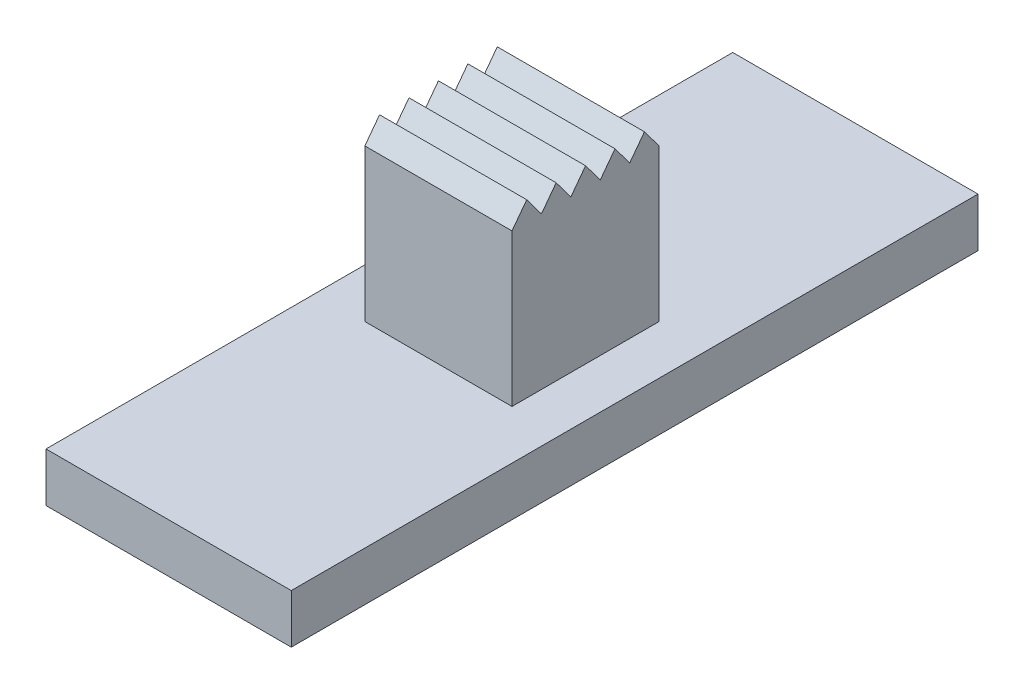
ISO-10303-21;
HEADER;
FILE_DESCRIPTION(('STEP AP214'),'2;1');
FILE_NAME('part.step','',(''),(''),'','','');
FILE_SCHEMA(('AUTOMOTIVE_DESIGN { 1 0 10303 214 1 1 1 1 }'));
ENDSEC;
DATA;
#1=APPLICATION_CONTEXT('core data for automotive mechanical design processes');
#2=APPLICATION_PROTOCOL_DEFINITION('international standard','automotive_design',2000,#1);
#3=PRODUCT_CONTEXT('',#1,'mechanical');
#4=PRODUCT('Part','Part','',(#3));
#5=PRODUCT_RELATED_PRODUCT_CATEGORY('part','',(#4));
#6=PRODUCT_DEFINITION_FORMATION('','',#4);
#7=PRODUCT_DEFINITION_CONTEXT('part definition',#1,'design');
#8=PRODUCT_DEFINITION('design','',#6,#7);
#9=PRODUCT_DEFINITION_SHAPE('','',#8);
#10=(LENGTH_UNIT() NAMED_UNIT(*) SI_UNIT(.MILLI.,.METRE.));
#11=(NAMED_UNIT(*) PLANE_ANGLE_UNIT() SI_UNIT($,.RADIAN.));
#12=(NAMED_UNIT(*) SI_UNIT($,.STERADIAN.) SOLID_ANGLE_UNIT());
#13=UNCERTAINTY_MEASURE_WITH_UNIT(LENGTH_MEASURE(1.E-05),#10,'distance_accuracy_value','');
#14=(GEOMETRIC_REPRESENTATION_CONTEXT(3) GLOBAL_UNCERTAINTY_ASSIGNED_CONTEXT((#13)) GLOBAL_UNIT_ASSIGNED_CONTEXT((#10,
#11,#12)) REPRESENTATION_CONTEXT('',''));
#15=CARTESIAN_POINT('',(0.,0.,0.));
#16=DIRECTION('',(0.,0.,1.));
#17=DIRECTION('',(1.,0.,0.));
#18=AXIS2_PLACEMENT_3D('',#15,#16,#17);
#19=CARTESIAN_POINT('',(-1.5,0.,0.));
#20=DIRECTION('',(-1.,0.,0.));
#21=DIRECTION('',(0.,0.,1.));
#22=AXIS2_PLACEMENT_3D('',#19,#20,#21);
#23=PLANE('',#22);
#24=DIRECTION('',(0.,1.,0.));
#25=VECTOR('',#24,1.);
#26=CARTESIAN_POINT('',(-1.5,3.1,-1.5));
#27=LINE('',#26,#25);
#28=CARTESIAN_POINT('',(-1.5,0.,-1.5));
#29=VERTEX_POINT('',#28);
#30=CARTESIAN_POINT('',(-1.5,3.1,-1.5));
#31=VERTEX_POINT('',#30);
#32=EDGE_CURVE('E230',#29,#31,#27,.T.);
#33=ORIENTED_EDGE('',*,*,#32,.F.);
#34=DIRECTION('',(0.,0.,1.));
#35=VECTOR('',#34,1.);
#36=CARTESIAN_POINT('',(-1.5,0.,7.));
#37=LINE('',#36,#35);
#38=CARTESIAN_POINT('',(-1.5,0.,1.5));
#39=VERTEX_POINT('',#38);
#40=EDGE_CURVE('E11',#29,#39,#37,.T.);
#41=ORIENTED_EDGE('',*,*,#40,.T.);
#42=DIRECTION('',(0.,-1.,0.));
#43=VECTOR('',#42,1.);
#44=CARTESIAN_POINT('',(-1.5,0.,1.5));
#45=LINE('',#44,#43);
#46=CARTESIAN_POINT('',(-1.5,3.1,1.5));
#47=VERTEX_POINT('',#46);
#48=EDGE_CURVE('E262',#47,#39,#45,.T.);
#49=ORIENTED_EDGE('',*,*,#48,.F.);
#50=DIRECTION('',(0.,-0.8,0.6));
#51=VECTOR('',#50,1.);
#52=CARTESIAN_POINT('',(-1.5,3.1,1.5));
#53=LINE('',#52,#51);
#54=CARTESIAN_POINT('',(-1.5,3.5,1.2));
#55=VERTEX_POINT('',#54);
#56=EDGE_CURVE('E260',#55,#47,#53,.T.);
#57=ORIENTED_EDGE('',*,*,#56,.F.);
#58=DIRECTION('',(0.,0.8,0.6));
#59=VECTOR('',#58,1.);
#60=CARTESIAN_POINT('',(-1.5,3.5,1.2));
#61=LINE('',#60,#59);
#62=CARTESIAN_POINT('',(-1.5,3.1,0.9));
#63=VERTEX_POINT('',#62);
#64=EDGE_CURVE('E257',#63,#55,#61,.T.);
#65=ORIENTED_EDGE('',*,*,#64,.F.);
#66=DIRECTION('',(0.,-0.8,0.6));
#67=VECTOR('',#66,1.);
#68=CARTESIAN_POINT('',(-1.5,3.1,0.9));
#69=LINE('',#68,#67);
#70=CARTESIAN_POINT('',(-1.5,3.5,0.6));
#71=VERTEX_POINT('',#70);
#72=EDGE_CURVE('E254',#71,#63,#69,.T.);
#73=ORIENTED_EDGE('',*,*,#72,.F.);
#74=DIRECTION('',(0.,0.8,0.6));
#75=VECTOR('',#74,1.);
#76=CARTESIAN_POINT('',(-1.5,3.5,0.6));
#77=LINE('',#76,#75);
#78=CARTESIAN_POINT('',(-1.5,3.1,0.3));
#79=VERTEX_POINT('',#78);
#80=EDGE_CURVE('E251',#79,#71,#77,.T.);
#81=ORIENTED_EDGE('',*,*,#80,.F.);
#82=DIRECTION('',(0.,-0.8,0.6));
#83=VECTOR('',#82,1.);
#84=CARTESIAN_POINT('',(-1.5,3.1,0.3));
#85=LINE('',#84,#83);
#86=CARTESIAN_POINT('',(-1.5,3.5,0.));
#87=VERTEX_POINT('',#86);
#88=EDGE_CURVE('E248',#87,#79,#85,.T.);
#89=ORIENTED_EDGE('',*,*,#88,.F.);
#90=DIRECTION('',(0.,0.8,0.6));
#91=VECTOR('',#90,1.);
#92=CARTESIAN_POINT('',(-1.5,3.1,-0.3));
#93=LINE('',#92,#91);
#94=CARTESIAN_POINT('',(-1.5,3.1,-0.3));
#95=VERTEX_POINT('',#94);
#96=EDGE_CURVE('E245',#95,#87,#93,.T.);
#97=ORIENTED_EDGE('',*,*,#96,.F.);
#98=DIRECTION('',(0.,-0.8,0.6));
#99=VECTOR('',#98,1.);
#100=CARTESIAN_POINT('',(-1.5,3.5,-0.600000000000001));
#101=LINE('',#100,#99);
#102=CARTESIAN_POINT('',(-1.5,3.5,-0.600000000000001));
#103=VERTEX_POINT('',#102);
#104=EDGE_CURVE('E242',#103,#95,#101,.T.);
#105=ORIENTED_EDGE('',*,*,#104,.F.);
#106=DIRECTION('',(0.,0.8,0.6));
#107=VECTOR('',#106,1.);
#108=CARTESIAN_POINT('',(-1.5,3.1,-0.900000000000001));
#109=LINE('',#108,#107);
#110=CARTESIAN_POINT('',(-1.5,3.1,-0.900000000000001));
#111=VERTEX_POINT('',#110);
#112=EDGE_CURVE('E239',#111,#103,#109,.T.);
#113=ORIENTED_EDGE('',*,*,#112,.F.);
#114=DIRECTION('',(0.,-0.8,0.6));
#115=VECTOR('',#114,1.);
#116=CARTESIAN_POINT('',(-1.5,3.5,-1.2));
#117=LINE('',#116,#115);
#118=CARTESIAN_POINT('',(-1.5,3.5,-1.2));
#119=VERTEX_POINT('',#118);
#120=EDGE_CURVE('E236',#119,#111,#117,.T.);
#121=ORIENTED_EDGE('',*,*,#120,.F.);
#122=DIRECTION('',(0.,0.8,0.6));
#123=VECTOR('',#122,1.);
#124=CARTESIAN_POINT('',(-1.5,3.1,-1.5));
#125=LINE('',#124,#123);
#126=EDGE_CURVE('E233',#31,#119,#125,.T.);
#127=ORIENTED_EDGE('',*,*,#126,.F.);
#128=EDGE_LOOP('',(#33,#41,#49,#57,#65,#73,#81,#89,#97,#105,#113,#121,#127));
#129=FACE_BOUND('',#128,.T.);
#130=ADVANCED_FACE('F33',(#129),#23,.T.);
#131=CARTESIAN_POINT('',(1.5,0.,0.));
#132=DIRECTION('',(-1.,0.,0.));
#133=DIRECTION('',(0.,0.,1.));
#134=AXIS2_PLACEMENT_3D('',#131,#132,#133);
#135=PLANE('',#134);
#136=DIRECTION('',(0.,0.,1.));
#137=VECTOR('',#136,1.);
#138=CARTESIAN_POINT('',(1.5,0.,7.));
#139=LINE('',#138,#137);
#140=CARTESIAN_POINT('',(1.5,0.,-1.5));
#141=VERTEX_POINT('',#140);
#142=CARTESIAN_POINT('',(1.5,0.,1.5));
#143=VERTEX_POINT('',#142);
#144=EDGE_CURVE('E42',#141,#143,#139,.T.);
#145=ORIENTED_EDGE('',*,*,#144,.F.);
#146=DIRECTION('',(0.,1.,0.));
#147=VECTOR('',#146,1.);
#148=CARTESIAN_POINT('',(1.5,3.1,-1.5));
#149=LINE('',#148,#147);
#150=CARTESIAN_POINT('',(1.5,3.1,-1.5));
#151=VERTEX_POINT('',#150);
#152=EDGE_CURVE('E192',#141,#151,#149,.T.);
#153=ORIENTED_EDGE('',*,*,#152,.T.);
#154=DIRECTION('',(0.,0.8,0.6));
#155=VECTOR('',#154,1.);
#156=CARTESIAN_POINT('',(1.5,3.1,-1.5));
#157=LINE('',#156,#155);
#158=CARTESIAN_POINT('',(1.5,3.5,-1.2));
#159=VERTEX_POINT('',#158);
#160=EDGE_CURVE('E197',#151,#159,#157,.T.);
#161=ORIENTED_EDGE('',*,*,#160,.T.);
#162=DIRECTION('',(0.,-0.8,0.6));
#163=VECTOR('',#162,1.);
#164=CARTESIAN_POINT('',(1.5,3.5,-1.2));
#165=LINE('',#164,#163);
#166=CARTESIAN_POINT('',(1.5,3.1,-0.900000000000001));
#167=VERTEX_POINT('',#166);
#168=EDGE_CURVE('E200',#159,#167,#165,.T.);
#169=ORIENTED_EDGE('',*,*,#168,.T.);
#170=DIRECTION('',(0.,0.8,0.6));
#171=VECTOR('',#170,1.);
#172=CARTESIAN_POINT('',(1.5,3.1,-0.900000000000001));
#173=LINE('',#172,#171);
#174=CARTESIAN_POINT('',(1.5,3.5,-0.600000000000001));
#175=VERTEX_POINT('',#174);
#176=EDGE_CURVE('E203',#167,#175,#173,.T.);
#177=ORIENTED_EDGE('',*,*,#176,.T.);
#178=DIRECTION('',(0.,-0.8,0.6));
#179=VECTOR('',#178,1.);
#180=CARTESIAN_POINT('',(1.5,3.5,-0.600000000000001));
#181=LINE('',#180,#179);
#182=CARTESIAN_POINT('',(1.5,3.1,-0.3));
#183=VERTEX_POINT('',#182);
#184=EDGE_CURVE('E206',#175,#183,#181,.T.);
#185=ORIENTED_EDGE('',*,*,#184,.T.);
#186=DIRECTION('',(0.,0.8,0.6));
#187=VECTOR('',#186,1.);
#188=CARTESIAN_POINT('',(1.5,3.1,-0.3));
#189=LINE('',#188,#187);
#190=CARTESIAN_POINT('',(1.5,3.5,0.));
#191=VERTEX_POINT('',#190);
#192=EDGE_CURVE('E209',#183,#191,#189,.T.);
#193=ORIENTED_EDGE('',*,*,#192,.T.);
#194=DIRECTION('',(0.,-0.8,0.6));
#195=VECTOR('',#194,1.);
#196=CARTESIAN_POINT('',(1.5,3.1,0.3));
#197=LINE('',#196,#195);
#198=CARTESIAN_POINT('',(1.5,3.1,0.3));
#199=VERTEX_POINT('',#198);
#200=EDGE_CURVE('E212',#191,#199,#197,.T.);
#201=ORIENTED_EDGE('',*,*,#200,.T.);
#202=DIRECTION('',(0.,0.8,0.6));
#203=VECTOR('',#202,1.);
#204=CARTESIAN_POINT('',(1.5,3.5,0.6));
#205=LINE('',#204,#203);
#206=CARTESIAN_POINT('',(1.5,3.5,0.6));
#207=VERTEX_POINT('',#206);
#208=EDGE_CURVE('E215',#199,#207,#205,.T.);
#209=ORIENTED_EDGE('',*,*,#208,.T.);
#210=DIRECTION('',(0.,-0.8,0.6));
#211=VECTOR('',#210,1.);
#212=CARTESIAN_POINT('',(1.5,3.1,0.9));
#213=LINE('',#212,#211);
#214=CARTESIAN_POINT('',(1.5,3.1,0.9));
#215=VERTEX_POINT('',#214);
#216=EDGE_CURVE('E218',#207,#215,#213,.T.);
#217=ORIENTED_EDGE('',*,*,#216,.T.);
#218=DIRECTION('',(0.,0.8,0.6));
#219=VECTOR('',#218,1.);
#220=CARTESIAN_POINT('',(1.5,3.5,1.2));
#221=LINE('',#220,#219);
#222=CARTESIAN_POINT('',(1.5,3.5,1.2));
#223=VERTEX_POINT('',#222);
#224=EDGE_CURVE('E221',#215,#223,#221,.T.);
#225=ORIENTED_EDGE('',*,*,#224,.T.);
#226=DIRECTION('',(0.,-0.8,0.6));
#227=VECTOR('',#226,1.);
#228=CARTESIAN_POINT('',(1.5,3.1,1.5));
#229=LINE('',#228,#227);
#230=CARTESIAN_POINT('',(1.5,3.1,1.5));
#231=VERTEX_POINT('',#230);
#232=EDGE_CURVE('E224',#223,#231,#229,.T.);
#233=ORIENTED_EDGE('',*,*,#232,.T.);
#234=DIRECTION('',(0.,-1.,0.));
#235=VECTOR('',#234,1.);
#236=CARTESIAN_POINT('',(1.5,0.,1.5));
#237=LINE('',#236,#235);
#238=EDGE_CURVE('E227',#231,#143,#237,.T.);
#239=ORIENTED_EDGE('',*,*,#238,.T.);
#240=EDGE_LOOP('',(#145,#153,#161,#169,#177,#185,#193,#201,#209,#217,#225,#233,#239));
#241=FACE_BOUND('',#240,.T.);
#242=ADVANCED_FACE('F308',(#241),#135,.F.);
#243=CARTESIAN_POINT('',(-1.5,-1.,7.));
#244=DIRECTION('',(0.,0.,1.));
#245=DIRECTION('',(1.,0.,0.));
#246=AXIS2_PLACEMENT_3D('',#243,#244,#245);
#247=PLANE('',#246);
#248=DIRECTION('',(1.,0.,0.));
#249=VECTOR('',#248,1.);
#250=CARTESIAN_POINT('',(-1.5,-1.,7.));
#251=LINE('',#250,#249);
#252=CARTESIAN_POINT('',(-2.5,-1.,7.));
#253=VERTEX_POINT('',#252);
#254=CARTESIAN_POINT('',(2.5,-1.,7.));
#255=VERTEX_POINT('',#254);
#256=EDGE_CURVE('E37',#253,#255,#251,.T.);
#257=ORIENTED_EDGE('',*,*,#256,.T.);
#258=DIRECTION('',(0.,-1.,0.));
#259=VECTOR('',#258,1.);
#260=CARTESIAN_POINT('',(2.5,0.,7.));
#261=LINE('',#260,#259);
#262=CARTESIAN_POINT('',(2.5,0.,7.));
#263=VERTEX_POINT('',#262);
#264=EDGE_CURVE('E160',#263,#255,#261,.T.);
#265=ORIENTED_EDGE('',*,*,#264,.F.);
#266=DIRECTION('',(1.,0.,0.));
#267=VECTOR('',#266,1.);
#268=CARTESIAN_POINT('',(-1.5,0.,7.));
#269=LINE('',#268,#267);
#270=CARTESIAN_POINT('',(-2.5,0.,7.));
#271=VERTEX_POINT('',#270);
#272=EDGE_CURVE('E155',#271,#263,#269,.T.);
#273=ORIENTED_EDGE('',*,*,#272,.F.);
#274=DIRECTION('',(0.,-1.,0.));
#275=VECTOR('',#274,1.);
#276=CARTESIAN_POINT('',(-2.5,0.,7.));
#277=LINE('',#276,#275);
#278=EDGE_CURVE('E157',#271,#253,#277,.T.);
#279=ORIENTED_EDGE('',*,*,#278,.T.);
#280=EDGE_LOOP('',(#257,#265,#273,#279));
#281=FACE_BOUND('',#280,.T.);
#282=ADVANCED_FACE('F35',(#281),#247,.T.);
#283=CARTESIAN_POINT('',(-1.5,0.,7.));
#284=DIRECTION('',(0.,1.,0.));
#285=DIRECTION('',(0.,0.,1.));
#286=AXIS2_PLACEMENT_3D('',#283,#284,#285);
#287=PLANE('',#286);
#288=ORIENTED_EDGE('',*,*,#40,.F.);
#289=DIRECTION('',(1.,0.,0.));
#290=VECTOR('',#289,1.);
#291=CARTESIAN_POINT('',(-1.5,0.,-1.5));
#292=LINE('',#291,#290);
#293=EDGE_CURVE('E285',#29,#141,#292,.T.);
#294=ORIENTED_EDGE('',*,*,#293,.T.);
#295=ORIENTED_EDGE('',*,*,#144,.T.);
#296=DIRECTION('',(1.,0.,0.));
#297=VECTOR('',#296,1.);
#298=CARTESIAN_POINT('',(-1.5,0.,1.5));
#299=LINE('',#298,#297);
#300=EDGE_CURVE('E165',#39,#143,#299,.T.);
#301=ORIENTED_EDGE('',*,*,#300,.F.);
#302=EDGE_LOOP('',(#288,#294,#295,#301));
#303=FACE_BOUND('',#302,.T.);
#304=ORIENTED_EDGE('',*,*,#272,.T.);
#305=DIRECTION('',(0.,0.,1.));
#306=VECTOR('',#305,1.);
#307=CARTESIAN_POINT('',(2.5,0.,7.));
#308=LINE('',#307,#306);
#309=CARTESIAN_POINT('',(2.5,0.,-7.));
#310=VERTEX_POINT('',#309);
#311=EDGE_CURVE('E190',#310,#263,#308,.T.);
#312=ORIENTED_EDGE('',*,*,#311,.F.);
#313=DIRECTION('',(1.,0.,0.));
#314=VECTOR('',#313,1.);
#315=CARTESIAN_POINT('',(-1.5,0.,-7.));
#316=LINE('',#315,#314);
#317=CARTESIAN_POINT('',(-2.5,0.,-7.));
#318=VERTEX_POINT('',#317);
#319=EDGE_CURVE('E177',#318,#310,#316,.T.);
#320=ORIENTED_EDGE('',*,*,#319,.F.);
#321=DIRECTION('',(0.,0.,1.));
#322=VECTOR('',#321,1.);
#323=CARTESIAN_POINT('',(-2.5,0.,7.));
#324=LINE('',#323,#322);
#325=EDGE_CURVE('E171',#318,#271,#324,.T.);
#326=ORIENTED_EDGE('',*,*,#325,.T.);
#327=EDGE_LOOP('',(#304,#312,#320,#326));
#328=FACE_BOUND('',#327,.T.);
#329=ADVANCED_FACE('F176',(#303,#328),#287,.T.);
#330=CARTESIAN_POINT('',(-1.5,0.,1.5));
#331=DIRECTION('',(0.,0.,1.));
#332=DIRECTION('',(0.,-1.,0.));
#333=AXIS2_PLACEMENT_3D('',#330,#331,#332);
#334=PLANE('',#333);
#335=ORIENTED_EDGE('',*,*,#300,.T.);
#336=ORIENTED_EDGE('',*,*,#238,.F.);
#337=DIRECTION('',(1.,0.,0.));
#338=VECTOR('',#337,1.);
#339=CARTESIAN_POINT('',(-1.5,3.1,1.5));
#340=LINE('',#339,#338);
#341=EDGE_CURVE('E50',#47,#231,#340,.T.);
#342=ORIENTED_EDGE('',*,*,#341,.F.);
#343=ORIENTED_EDGE('',*,*,#48,.T.);
#344=EDGE_LOOP('',(#335,#336,#342,#343));
#345=FACE_BOUND('',#344,.T.);
#346=ADVANCED_FACE('F321',(#345),#334,.T.);
#347=CARTESIAN_POINT('',(-1.5,3.1,1.5));
#348=DIRECTION('',(0.,0.6,0.8));
#349=DIRECTION('',(0.,-0.8,0.6));
#350=AXIS2_PLACEMENT_3D('',#347,#348,#349);
#351=PLANE('',#350);
#352=ORIENTED_EDGE('',*,*,#341,.T.);
#353=ORIENTED_EDGE('',*,*,#232,.F.);
#354=DIRECTION('',(1.,0.,0.));
#355=VECTOR('',#354,1.);
#356=CARTESIAN_POINT('',(-1.5,3.5,1.2));
#357=LINE('',#356,#355);
#358=EDGE_CURVE('E58',#55,#223,#357,.T.);
#359=ORIENTED_EDGE('',*,*,#358,.F.);
#360=ORIENTED_EDGE('',*,*,#56,.T.);
#361=EDGE_LOOP('',(#352,#353,#359,#360));
#362=FACE_BOUND('',#361,.T.);
#363=ADVANCED_FACE('F325',(#362),#351,.T.);
#364=CARTESIAN_POINT('',(-1.5,3.5,1.2));
#365=DIRECTION('',(0.,0.6,-0.8));
#366=DIRECTION('',(0.,0.8,0.6));
#367=AXIS2_PLACEMENT_3D('',#364,#365,#366);
#368=PLANE('',#367);
#369=ORIENTED_EDGE('',*,*,#358,.T.);
#370=ORIENTED_EDGE('',*,*,#224,.F.);
#371=DIRECTION('',(1.,0.,0.));
#372=VECTOR('',#371,1.);
#373=CARTESIAN_POINT('',(-1.5,3.1,0.9));
#374=LINE('',#373,#372);
#375=EDGE_CURVE('E267',#63,#215,#374,.T.);
#376=ORIENTED_EDGE('',*,*,#375,.F.);
#377=ORIENTED_EDGE('',*,*,#64,.T.);
#378=EDGE_LOOP('',(#369,#370,#376,#377));
#379=FACE_BOUND('',#378,.T.);
#380=ADVANCED_FACE('F328',(#379),#368,.T.);
#381=CARTESIAN_POINT('',(-1.5,3.1,0.9));
#382=DIRECTION('',(0.,0.6,0.8));
#383=DIRECTION('',(0.,-0.8,0.6));
#384=AXIS2_PLACEMENT_3D('',#381,#382,#383);
#385=PLANE('',#384);
#386=ORIENTED_EDGE('',*,*,#375,.T.);
#387=ORIENTED_EDGE('',*,*,#216,.F.);
#388=DIRECTION('',(1.,0.,0.));
#389=VECTOR('',#388,1.);
#390=CARTESIAN_POINT('',(-1.5,3.5,0.6));
#391=LINE('',#390,#389);
#392=EDGE_CURVE('E269',#71,#207,#391,.T.);
#393=ORIENTED_EDGE('',*,*,#392,.F.);
#394=ORIENTED_EDGE('',*,*,#72,.T.);
#395=EDGE_LOOP('',(#386,#387,#393,#394));
#396=FACE_BOUND('',#395,.T.);
#397=ADVANCED_FACE('F331',(#396),#385,.T.);
#398=CARTESIAN_POINT('',(-1.5,3.5,0.6));
#399=DIRECTION('',(0.,0.6,-0.8));
#400=DIRECTION('',(0.,0.8,0.6));
#401=AXIS2_PLACEMENT_3D('',#398,#399,#400);
#402=PLANE('',#401);
#403=ORIENTED_EDGE('',*,*,#392,.T.);
#404=ORIENTED_EDGE('',*,*,#208,.F.);
#405=DIRECTION('',(1.,0.,0.));
#406=VECTOR('',#405,1.);
#407=CARTESIAN_POINT('',(-1.5,3.1,0.3));
#408=LINE('',#407,#406);
#409=EDGE_CURVE('E271',#79,#199,#408,.T.);
#410=ORIENTED_EDGE('',*,*,#409,.F.);
#411=ORIENTED_EDGE('',*,*,#80,.T.);
#412=EDGE_LOOP('',(#403,#404,#410,#411));
#413=FACE_BOUND('',#412,.T.);
#414=ADVANCED_FACE('F335',(#413),#402,.T.);
#415=CARTESIAN_POINT('',(-1.5,3.1,0.3));
#416=DIRECTION('',(0.,0.6,0.8));
#417=DIRECTION('',(0.,-0.8,0.6));
#418=AXIS2_PLACEMENT_3D('',#415,#416,#417);
#419=PLANE('',#418);
#420=ORIENTED_EDGE('',*,*,#409,.T.);
#421=ORIENTED_EDGE('',*,*,#200,.F.);
#422=DIRECTION('',(1.,0.,0.));
#423=VECTOR('',#422,1.);
#424=CARTESIAN_POINT('',(-1.5,3.5,0.));
#425=LINE('',#424,#423);
#426=EDGE_CURVE('E273',#87,#191,#425,.T.);
#427=ORIENTED_EDGE('',*,*,#426,.F.);
#428=ORIENTED_EDGE('',*,*,#88,.T.);
#429=EDGE_LOOP('',(#420,#421,#427,#428));
#430=FACE_BOUND('',#429,.T.);
#431=ADVANCED_FACE('F339',(#430),#419,.T.);
#432=CARTESIAN_POINT('',(-1.5,3.1,-0.3));
#433=DIRECTION('',(0.,0.6,-0.8));
#434=DIRECTION('',(0.,0.8,0.6));
#435=AXIS2_PLACEMENT_3D('',#432,#433,#434);
#436=PLANE('',#435);
#437=ORIENTED_EDGE('',*,*,#426,.T.);
#438=ORIENTED_EDGE('',*,*,#192,.F.);
#439=DIRECTION('',(1.,0.,0.));
#440=VECTOR('',#439,1.);
#441=CARTESIAN_POINT('',(-1.5,3.1,-0.3));
#442=LINE('',#441,#440);
#443=EDGE_CURVE('E275',#95,#183,#442,.T.);
#444=ORIENTED_EDGE('',*,*,#443,.F.);
#445=ORIENTED_EDGE('',*,*,#96,.T.);
#446=EDGE_LOOP('',(#437,#438,#444,#445));
#447=FACE_BOUND('',#446,.T.);
#448=ADVANCED_FACE('F343',(#447),#436,.T.);
#449=CARTESIAN_POINT('',(-1.5,3.5,-0.600000000000001));
#450=DIRECTION('',(0.,0.6,0.8));
#451=DIRECTION('',(0.,-0.8,0.6));
#452=AXIS2_PLACEMENT_3D('',#449,#450,#451);
#453=PLANE('',#452);
#454=ORIENTED_EDGE('',*,*,#443,.T.);
#455=ORIENTED_EDGE('',*,*,#184,.F.);
#456=DIRECTION('',(1.,0.,0.));
#457=VECTOR('',#456,1.);
#458=CARTESIAN_POINT('',(-1.5,3.5,-0.600000000000001));
#459=LINE('',#458,#457);
#460=EDGE_CURVE('E277',#103,#175,#459,.T.);
#461=ORIENTED_EDGE('',*,*,#460,.F.);
#462=ORIENTED_EDGE('',*,*,#104,.T.);
#463=EDGE_LOOP('',(#454,#455,#461,#462));
#464=FACE_BOUND('',#463,.T.);
#465=ADVANCED_FACE('F347',(#464),#453,.T.);
#466=CARTESIAN_POINT('',(-1.5,3.1,-0.900000000000001));
#467=DIRECTION('',(0.,0.6,-0.8));
#468=DIRECTION('',(0.,0.8,0.6));
#469=AXIS2_PLACEMENT_3D('',#466,#467,#468);
#470=PLANE('',#469);
#471=ORIENTED_EDGE('',*,*,#460,.T.);
#472=ORIENTED_EDGE('',*,*,#176,.F.);
#473=DIRECTION('',(1.,0.,0.));
#474=VECTOR('',#473,1.);
#475=CARTESIAN_POINT('',(-1.5,3.1,-0.900000000000001));
#476=LINE('',#475,#474);
#477=EDGE_CURVE('E279',#111,#167,#476,.T.);
#478=ORIENTED_EDGE('',*,*,#477,.F.);
#479=ORIENTED_EDGE('',*,*,#112,.T.);
#480=EDGE_LOOP('',(#471,#472,#478,#479));
#481=FACE_BOUND('',#480,.T.);
#482=ADVANCED_FACE('F351',(#481),#470,.T.);
#483=CARTESIAN_POINT('',(-1.5,3.5,-1.2));
#484=DIRECTION('',(0.,0.6,0.8));
#485=DIRECTION('',(0.,-0.8,0.6));
#486=AXIS2_PLACEMENT_3D('',#483,#484,#485);
#487=PLANE('',#486);
#488=ORIENTED_EDGE('',*,*,#477,.T.);
#489=ORIENTED_EDGE('',*,*,#168,.F.);
#490=DIRECTION('',(1.,0.,0.));
#491=VECTOR('',#490,1.);
#492=CARTESIAN_POINT('',(-1.5,3.5,-1.2));
#493=LINE('',#492,#491);
#494=EDGE_CURVE('E281',#119,#159,#493,.T.);
#495=ORIENTED_EDGE('',*,*,#494,.F.);
#496=ORIENTED_EDGE('',*,*,#120,.T.);
#497=EDGE_LOOP('',(#488,#489,#495,#496));
#498=FACE_BOUND('',#497,.T.);
#499=ADVANCED_FACE('F355',(#498),#487,.T.);
#500=CARTESIAN_POINT('',(-1.5,3.1,-1.5));
#501=DIRECTION('',(0.,0.6,-0.8));
#502=DIRECTION('',(0.,0.8,0.6));
#503=AXIS2_PLACEMENT_3D('',#500,#501,#502);
#504=PLANE('',#503);
#505=ORIENTED_EDGE('',*,*,#494,.T.);
#506=ORIENTED_EDGE('',*,*,#160,.F.);
#507=DIRECTION('',(1.,0.,0.));
#508=VECTOR('',#507,1.);
#509=CARTESIAN_POINT('',(-1.5,3.1,-1.5));
#510=LINE('',#509,#508);
#511=EDGE_CURVE('E283',#31,#151,#510,.T.);
#512=ORIENTED_EDGE('',*,*,#511,.F.);
#513=ORIENTED_EDGE('',*,*,#126,.T.);
#514=EDGE_LOOP('',(#505,#506,#512,#513));
#515=FACE_BOUND('',#514,.T.);
#516=ADVANCED_FACE('F304',(#515),#504,.T.);
#517=CARTESIAN_POINT('',(-1.5,3.1,-1.5));
#518=DIRECTION('',(0.,0.,-1.));
#519=DIRECTION('',(0.,1.,0.));
#520=AXIS2_PLACEMENT_3D('',#517,#518,#519);
#521=PLANE('',#520);
#522=ORIENTED_EDGE('',*,*,#511,.T.);
#523=ORIENTED_EDGE('',*,*,#152,.F.);
#524=ORIENTED_EDGE('',*,*,#293,.F.);
#525=ORIENTED_EDGE('',*,*,#32,.T.);
#526=EDGE_LOOP('',(#522,#523,#524,#525));
#527=FACE_BOUND('',#526,.T.);
#528=ADVANCED_FACE('F298',(#527),#521,.T.);
#529=CARTESIAN_POINT('',(-1.5,0.,-7.));
#530=DIRECTION('',(0.,0.,-1.));
#531=DIRECTION('',(-1.,0.,0.));
#532=AXIS2_PLACEMENT_3D('',#529,#530,#531);
#533=PLANE('',#532);
#534=ORIENTED_EDGE('',*,*,#319,.T.);
#535=DIRECTION('',(0.,1.,0.));
#536=VECTOR('',#535,1.);
#537=CARTESIAN_POINT('',(2.5,0.,-7.));
#538=LINE('',#537,#536);
#539=CARTESIAN_POINT('',(2.5,-1.,-7.));
#540=VERTEX_POINT('',#539);
#541=EDGE_CURVE('E187',#540,#310,#538,.T.);
#542=ORIENTED_EDGE('',*,*,#541,.F.);
#543=DIRECTION('',(1.,0.,0.));
#544=VECTOR('',#543,1.);
#545=CARTESIAN_POINT('',(-1.5,-1.,-7.));
#546=LINE('',#545,#544);
#547=CARTESIAN_POINT('',(-2.5,-1.,-7.));
#548=VERTEX_POINT('',#547);
#549=EDGE_CURVE('E288',#548,#540,#546,.T.);
#550=ORIENTED_EDGE('',*,*,#549,.F.);
#551=DIRECTION('',(0.,1.,0.));
#552=VECTOR('',#551,1.);
#553=CARTESIAN_POINT('',(-2.5,0.,-7.));
#554=LINE('',#553,#552);
#555=EDGE_CURVE('E178',#548,#318,#554,.T.);
#556=ORIENTED_EDGE('',*,*,#555,.T.);
#557=EDGE_LOOP('',(#534,#542,#550,#556));
#558=FACE_BOUND('',#557,.T.);
#559=ADVANCED_FACE('F296',(#558),#533,.T.);
#560=CARTESIAN_POINT('',(-1.5,-1.,-7.));
#561=DIRECTION('',(0.,-1.,0.));
#562=DIRECTION('',(0.,0.,-1.));
#563=AXIS2_PLACEMENT_3D('',#560,#561,#562);
#564=PLANE('',#563);
#565=ORIENTED_EDGE('',*,*,#549,.T.);
#566=DIRECTION('',(0.,0.,-1.));
#567=VECTOR('',#566,1.);
#568=CARTESIAN_POINT('',(2.5,-1.,7.));
#569=LINE('',#568,#567);
#570=EDGE_CURVE('E184',#255,#540,#569,.T.);
#571=ORIENTED_EDGE('',*,*,#570,.F.);
#572=ORIENTED_EDGE('',*,*,#256,.F.);
#573=DIRECTION('',(0.,0.,-1.));
#574=VECTOR('',#573,1.);
#575=CARTESIAN_POINT('',(-2.5,-1.,7.));
#576=LINE('',#575,#574);
#577=EDGE_CURVE('E174',#253,#548,#576,.T.);
#578=ORIENTED_EDGE('',*,*,#577,.T.);
#579=EDGE_LOOP('',(#565,#571,#572,#578));
#580=FACE_BOUND('',#579,.T.);
#581=ADVANCED_FACE('F291',(#580),#564,.T.);
#582=CARTESIAN_POINT('',(2.5,0.,0.));
#583=DIRECTION('',(1.,0.,0.));
#584=DIRECTION('',(0.,0.,-1.));
#585=AXIS2_PLACEMENT_3D('',#582,#583,#584);
#586=PLANE('',#585);
#587=ORIENTED_EDGE('',*,*,#264,.T.);
#588=ORIENTED_EDGE('',*,*,#570,.T.);
#589=ORIENTED_EDGE('',*,*,#541,.T.);
#590=ORIENTED_EDGE('',*,*,#311,.T.);
#591=EDGE_LOOP('',(#587,#588,#589,#590));
#592=FACE_BOUND('',#591,.T.);
#593=ADVANCED_FACE('F294',(#592),#586,.T.);
#594=CARTESIAN_POINT('',(-2.5,0.,0.));
#595=DIRECTION('',(-1.,0.,0.));
#596=DIRECTION('',(0.,0.,-1.));
#597=AXIS2_PLACEMENT_3D('',#594,#595,#596);
#598=PLANE('',#597);
#599=ORIENTED_EDGE('',*,*,#278,.F.);
#600=ORIENTED_EDGE('',*,*,#325,.F.);
#601=ORIENTED_EDGE('',*,*,#555,.F.);
#602=ORIENTED_EDGE('',*,*,#577,.F.);
#603=EDGE_LOOP('',(#599,#600,#601,#602));
#604=FACE_BOUND('',#603,.T.);
#605=ADVANCED_FACE('F169',(#604),#598,.T.);
#606=CLOSED_SHELL('',(#130,#242,#282,#329,#346,#363,#380,#397,#414,#431,#448,#465,#482,#499,
#516,#528,#559,#581,#593,#605));
#607=MANIFOLD_SOLID_BREP('B2',#606);
#608=ADVANCED_BREP_SHAPE_REPRESENTATION('',(#18,#607),#14);
#609=SHAPE_DEFINITION_REPRESENTATION(#9,#608);
ENDSEC;
END-ISO-10303-21;
